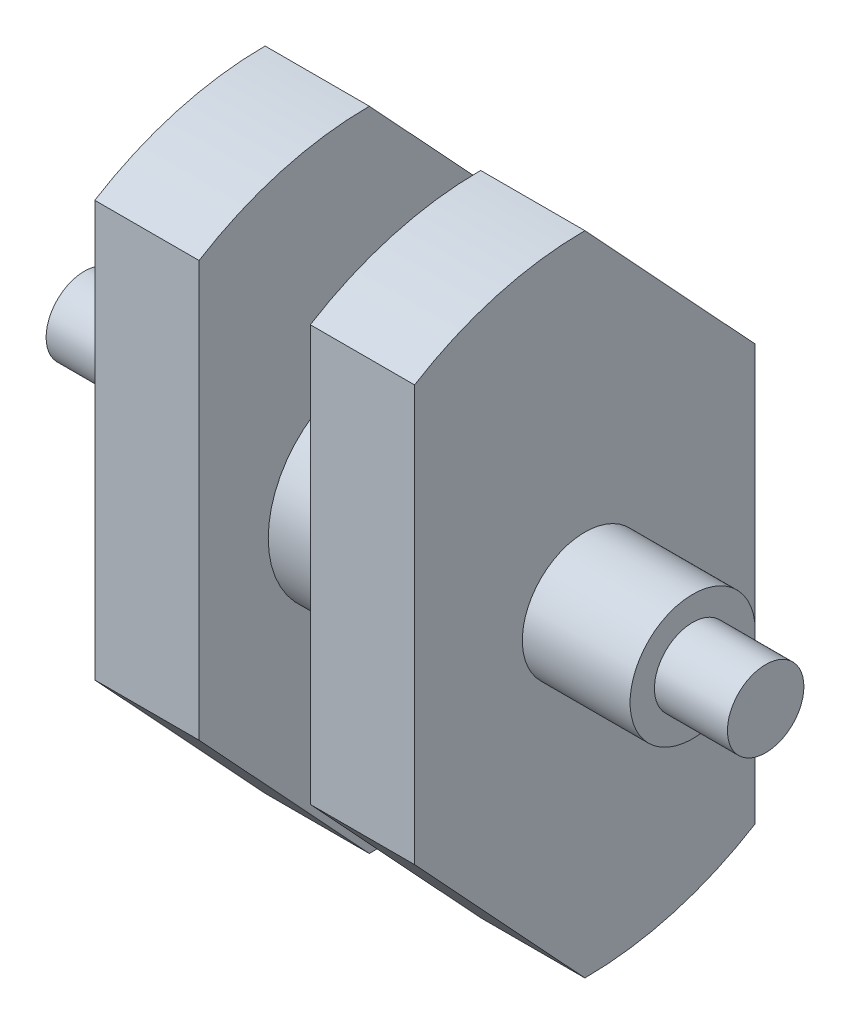
ISO-10303-21;
HEADER;
FILE_DESCRIPTION(('STEP AP214'),'2;1');
FILE_NAME('part.step','',(''),(''),'','','');
FILE_SCHEMA(('AUTOMOTIVE_DESIGN { 1 0 10303 214 1 1 1 1 }'));
ENDSEC;
DATA;
#1=APPLICATION_CONTEXT('core data for automotive mechanical design processes');
#2=APPLICATION_PROTOCOL_DEFINITION('international standard','automotive_design',2000,#1);
#3=PRODUCT_CONTEXT('',#1,'mechanical');
#4=PRODUCT('Part','Part','',(#3));
#5=PRODUCT_RELATED_PRODUCT_CATEGORY('part','',(#4));
#6=PRODUCT_DEFINITION_FORMATION('','',#4);
#7=PRODUCT_DEFINITION_CONTEXT('part definition',#1,'design');
#8=PRODUCT_DEFINITION('design','',#6,#7);
#9=PRODUCT_DEFINITION_SHAPE('','',#8);
#10=(LENGTH_UNIT() NAMED_UNIT(*) SI_UNIT(.MILLI.,.METRE.));
#11=(NAMED_UNIT(*) PLANE_ANGLE_UNIT() SI_UNIT($,.RADIAN.));
#12=(NAMED_UNIT(*) SI_UNIT($,.STERADIAN.) SOLID_ANGLE_UNIT());
#13=UNCERTAINTY_MEASURE_WITH_UNIT(LENGTH_MEASURE(1.E-05),#10,'distance_accuracy_value','');
#14=(GEOMETRIC_REPRESENTATION_CONTEXT(3) GLOBAL_UNCERTAINTY_ASSIGNED_CONTEXT((#13)) GLOBAL_UNIT_ASSIGNED_CONTEXT((#10,
#11,#12)) REPRESENTATION_CONTEXT('',''));
#15=CARTESIAN_POINT('',(0.,0.,0.));
#16=DIRECTION('',(0.,0.,1.));
#17=DIRECTION('',(1.,0.,0.));
#18=AXIS2_PLACEMENT_3D('',#15,#16,#17);
#19=CARTESIAN_POINT('',(49.,0.,0.));
#20=DIRECTION('',(-1.,0.,0.));
#21=DIRECTION('',(0.,0.,1.));
#22=AXIS2_PLACEMENT_3D('',#19,#20,#21);
#23=CYLINDRICAL_SURFACE('',#22,46.55);
#24=CARTESIAN_POINT('',(-7.99999999999994,0.,0.));
#25=DIRECTION('',(1.,0.,0.));
#26=DIRECTION('',(0.,0.,-1.));
#27=AXIS2_PLACEMENT_3D('',#24,#25,#26);
#28=CIRCLE('',#27,46.55);
#29=CARTESIAN_POINT('',(-7.99999999999994,-46.55,0.));
#30=VERTEX_POINT('',#29);
#31=CARTESIAN_POINT('',(-7.99999999999994,-39.5809613324386,-24.5));
#32=VERTEX_POINT('',#31);
#33=EDGE_CURVE('E256',#30,#32,#28,.T.);
#34=ORIENTED_EDGE('',*,*,#33,.F.);
#35=DIRECTION('',(1.,0.,0.));
#36=VECTOR('',#35,1.);
#37=CARTESIAN_POINT('',(-49.,-46.55,0.));
#38=LINE('',#37,#36);
#39=CARTESIAN_POINT('',(-23.,-46.55,0.));
#40=VERTEX_POINT('',#39);
#41=EDGE_CURVE('E166',#40,#30,#38,.T.);
#42=ORIENTED_EDGE('',*,*,#41,.F.);
#43=CARTESIAN_POINT('',(-23.,0.,0.));
#44=DIRECTION('',(-1.,0.,0.));
#45=DIRECTION('',(0.,0.,1.));
#46=AXIS2_PLACEMENT_3D('',#43,#44,#45);
#47=CIRCLE('',#46,46.55);
#48=CARTESIAN_POINT('',(-23.,-39.5809613324386,-24.5));
#49=VERTEX_POINT('',#48);
#50=EDGE_CURVE('E228',#49,#40,#47,.T.);
#51=ORIENTED_EDGE('',*,*,#50,.F.);
#52=DIRECTION('',(1.,0.,0.));
#53=VECTOR('',#52,1.);
#54=CARTESIAN_POINT('',(-49.,-39.5809613324386,-24.5));
#55=LINE('',#54,#53);
#56=EDGE_CURVE('E158',#49,#32,#55,.T.);
#57=ORIENTED_EDGE('',*,*,#56,.T.);
#58=EDGE_LOOP('',(#34,#42,#51,#57));
#59=FACE_BOUND('',#58,.T.);
#60=ADVANCED_FACE('F43',(#59),#23,.T.);
#61=CARTESIAN_POINT('',(-7.99999999999994,0.,0.));
#62=DIRECTION('',(1.,0.,0.));
#63=DIRECTION('',(0.,0.,-1.));
#64=AXIS2_PLACEMENT_3D('',#61,#62,#63);
#65=CIRCLE('',#64,46.55);
#66=CARTESIAN_POINT('',(-7.99999999999994,46.55,0.));
#67=VERTEX_POINT('',#66);
#68=CARTESIAN_POINT('',(-7.99999999999994,39.5809613324384,24.5000000000003));
#69=VERTEX_POINT('',#68);
#70=EDGE_CURVE('E260',#67,#69,#65,.T.);
#71=ORIENTED_EDGE('',*,*,#70,.F.);
#72=DIRECTION('',(1.,0.,0.));
#73=VECTOR('',#72,1.);
#74=CARTESIAN_POINT('',(-49.,46.55,0.));
#75=LINE('',#74,#73);
#76=CARTESIAN_POINT('',(-23.,46.55,0.));
#77=VERTEX_POINT('',#76);
#78=EDGE_CURVE('E146',#77,#67,#75,.T.);
#79=ORIENTED_EDGE('',*,*,#78,.F.);
#80=CARTESIAN_POINT('',(-23.,0.,0.));
#81=DIRECTION('',(-1.,0.,0.));
#82=DIRECTION('',(0.,0.,1.));
#83=AXIS2_PLACEMENT_3D('',#80,#81,#82);
#84=CIRCLE('',#83,46.55);
#85=CARTESIAN_POINT('',(-23.,39.5809613324384,24.5000000000003));
#86=VERTEX_POINT('',#85);
#87=EDGE_CURVE('E221',#86,#77,#84,.T.);
#88=ORIENTED_EDGE('',*,*,#87,.F.);
#89=DIRECTION('',(1.,0.,0.));
#90=VECTOR('',#89,1.);
#91=CARTESIAN_POINT('',(-49.,39.5809613324384,24.5000000000003));
#92=LINE('',#91,#90);
#93=EDGE_CURVE('E175',#86,#69,#92,.T.);
#94=ORIENTED_EDGE('',*,*,#93,.T.);
#95=EDGE_LOOP('',(#71,#79,#88,#94));
#96=FACE_BOUND('',#95,.T.);
#97=ADVANCED_FACE('F269',(#96),#23,.T.);
#98=CARTESIAN_POINT('',(-49.,-1.67741515161766E-13,24.5));
#99=DIRECTION('',(0.,0.,1.));
#100=DIRECTION('',(0.,-1.,0.));
#101=AXIS2_PLACEMENT_3D('',#98,#99,#100);
#102=PLANE('',#101);
#103=DIRECTION('',(1.,0.,0.));
#104=VECTOR('',#103,1.);
#105=CARTESIAN_POINT('',(-49.,-20.1729266217803,24.4999999999999));
#106=LINE('',#105,#104);
#107=CARTESIAN_POINT('',(-23.,-20.1729266217803,24.4999999999999));
#108=VERTEX_POINT('',#107);
#109=CARTESIAN_POINT('',(-7.99999999999994,-20.1729266217803,24.4999999999999));
#110=VERTEX_POINT('',#109);
#111=EDGE_CURVE('E161',#108,#110,#106,.T.);
#112=ORIENTED_EDGE('',*,*,#111,.T.);
#113=DIRECTION('',(0.,1.,0.));
#114=VECTOR('',#113,1.);
#115=CARTESIAN_POINT('',(-7.99999999999994,-1.67741515161766E-13,24.5));
#116=LINE('',#115,#114);
#117=EDGE_CURVE('E196',#110,#69,#116,.T.);
#118=ORIENTED_EDGE('',*,*,#117,.T.);
#119=ORIENTED_EDGE('',*,*,#93,.F.);
#120=DIRECTION('',(0.,-1.,0.));
#121=VECTOR('',#120,1.);
#122=CARTESIAN_POINT('',(-23.,-1.67741515161766E-13,24.5));
#123=LINE('',#122,#121);
#124=EDGE_CURVE('E160',#86,#108,#123,.T.);
#125=ORIENTED_EDGE('',*,*,#124,.T.);
#126=EDGE_LOOP('',(#112,#118,#119,#125));
#127=FACE_BOUND('',#126,.T.);
#128=ADVANCED_FACE('F263',(#127),#102,.T.);
#129=CARTESIAN_POINT('',(-49.,-21.5599054783952,23.2117228094332));
#130=DIRECTION('',(0.,0.680555555555558,-0.73269648272833));
#131=DIRECTION('',(0.,0.73269648272833,0.680555555555558));
#132=AXIS2_PLACEMENT_3D('',#129,#130,#131);
#133=PLANE('',#132);
#134=DIRECTION('',(0.,-0.73269648272833,-0.680555555555558));
#135=VECTOR('',#134,1.);
#136=CARTESIAN_POINT('',(-7.99999999999994,-21.5599054783952,23.2117228094332));
#137=LINE('',#136,#135);
#138=EDGE_CURVE('E258',#110,#30,#137,.T.);
#139=ORIENTED_EDGE('',*,*,#138,.F.);
#140=ORIENTED_EDGE('',*,*,#111,.F.);
#141=DIRECTION('',(0.,0.73269648272833,0.680555555555558));
#142=VECTOR('',#141,1.);
#143=CARTESIAN_POINT('',(-23.,-21.5599054783952,23.2117228094332));
#144=LINE('',#143,#142);
#145=EDGE_CURVE('E227',#40,#108,#144,.T.);
#146=ORIENTED_EDGE('',*,*,#145,.F.);
#147=ORIENTED_EDGE('',*,*,#41,.T.);
#148=EDGE_LOOP('',(#139,#140,#146,#147));
#149=FACE_BOUND('',#148,.T.);
#150=ADVANCED_FACE('F283',(#149),#133,.F.);
#151=CARTESIAN_POINT('',(-49.,0.,-24.5));
#152=DIRECTION('',(0.,0.,1.));
#153=DIRECTION('',(1.,0.,0.));
#154=AXIS2_PLACEMENT_3D('',#151,#152,#153);
#155=PLANE('',#154);
#156=DIRECTION('',(0.,1.,0.));
#157=VECTOR('',#156,1.);
#158=CARTESIAN_POINT('',(-7.99999999999994,0.,-24.5));
#159=LINE('',#158,#157);
#160=CARTESIAN_POINT('',(-7.99999999999994,20.17292662178,-24.5));
#161=VERTEX_POINT('',#160);
#162=EDGE_CURVE('E61',#32,#161,#159,.T.);
#163=ORIENTED_EDGE('',*,*,#162,.F.);
#164=ORIENTED_EDGE('',*,*,#56,.F.);
#165=DIRECTION('',(0.,-1.,0.));
#166=VECTOR('',#165,1.);
#167=CARTESIAN_POINT('',(-23.,0.,-24.5));
#168=LINE('',#167,#166);
#169=CARTESIAN_POINT('',(-23.,20.17292662178,-24.5));
#170=VERTEX_POINT('',#169);
#171=EDGE_CURVE('E225',#170,#49,#168,.T.);
#172=ORIENTED_EDGE('',*,*,#171,.F.);
#173=DIRECTION('',(1.,0.,0.));
#174=VECTOR('',#173,1.);
#175=CARTESIAN_POINT('',(-49.,20.17292662178,-24.5));
#176=LINE('',#175,#174);
#177=EDGE_CURVE('E149',#170,#161,#176,.T.);
#178=ORIENTED_EDGE('',*,*,#177,.T.);
#179=EDGE_LOOP('',(#163,#164,#172,#178));
#180=FACE_BOUND('',#179,.T.);
#181=ADVANCED_FACE('F279',(#180),#155,.F.);
#182=CARTESIAN_POINT('',(-49.,21.5599054783951,-23.2117228094332));
#183=DIRECTION('',(0.,-0.680555555555556,0.732696482728332));
#184=DIRECTION('',(0.,-0.732696482728332,-0.680555555555556));
#185=AXIS2_PLACEMENT_3D('',#182,#183,#184);
#186=PLANE('',#185);
#187=DIRECTION('',(0.,0.732696482728332,0.680555555555556));
#188=VECTOR('',#187,1.);
#189=CARTESIAN_POINT('',(-7.99999999999994,21.5599054783951,-23.2117228094332));
#190=LINE('',#189,#188);
#191=EDGE_CURVE('E12',#161,#67,#190,.T.);
#192=ORIENTED_EDGE('',*,*,#191,.F.);
#193=ORIENTED_EDGE('',*,*,#177,.F.);
#194=DIRECTION('',(0.,-0.732696482728332,-0.680555555555556));
#195=VECTOR('',#194,1.);
#196=CARTESIAN_POINT('',(-23.,21.5599054783951,-23.2117228094332));
#197=LINE('',#196,#195);
#198=EDGE_CURVE('E168',#77,#170,#197,.T.);
#199=ORIENTED_EDGE('',*,*,#198,.F.);
#200=ORIENTED_EDGE('',*,*,#78,.T.);
#201=EDGE_LOOP('',(#192,#193,#199,#200));
#202=FACE_BOUND('',#201,.T.);
#203=ADVANCED_FACE('F277',(#202),#186,.F.);
#204=CARTESIAN_POINT('',(-23.,0.,0.));
#205=DIRECTION('',(-1.,0.,0.));
#206=DIRECTION('',(0.,0.,1.));
#207=AXIS2_PLACEMENT_3D('',#204,#205,#206);
#208=CYLINDRICAL_SURFACE('',#207,9.);
#209=CARTESIAN_POINT('',(-23.,0.,0.));
#210=DIRECTION('',(1.,0.,0.));
#211=DIRECTION('',(0.,0.,-1.));
#212=AXIS2_PLACEMENT_3D('',#209,#210,#211);
#213=CIRCLE('',#212,9.);
#214=CARTESIAN_POINT('',(-23.,0.,9.));
#215=VERTEX_POINT('',#214);
#216=EDGE_CURVE('E218',#215,#215,#213,.T.);
#217=CARTESIAN_POINT('',(-38.5,0.,0.));
#218=DIRECTION('',(-1.,0.,0.));
#219=DIRECTION('',(0.,0.,1.));
#220=AXIS2_PLACEMENT_3D('',#217,#218,#219);
#221=CIRCLE('',#220,9.);
#222=CARTESIAN_POINT('',(-38.5,0.,9.));
#223=VERTEX_POINT('',#222);
#224=EDGE_CURVE('E185',#223,#223,#221,.T.);
#225=CARTESIAN_POINT('',(-23.,0.,9.));
#226=CARTESIAN_POINT('',(-23.1614583333333,0.,9.));
#227=CARTESIAN_POINT('',(-23.3229166666667,0.,9.));
#228=CARTESIAN_POINT('',(-23.6458333333333,0.,9.));
#229=CARTESIAN_POINT('',(-23.8072916666667,0.,9.));
#230=CARTESIAN_POINT('',(-24.1302083333333,0.,9.));
#231=CARTESIAN_POINT('',(-24.2916666666667,0.,9.));
#232=CARTESIAN_POINT('',(-24.6145833333333,0.,9.));
#233=CARTESIAN_POINT('',(-24.7760416666667,0.,9.));
#234=CARTESIAN_POINT('',(-25.0989583333333,0.,9.));
#235=CARTESIAN_POINT('',(-25.2604166666667,0.,9.));
#236=CARTESIAN_POINT('',(-25.5833333333333,0.,9.));
#237=CARTESIAN_POINT('',(-25.7447916666667,0.,9.));
#238=CARTESIAN_POINT('',(-26.0677083333333,0.,9.));
#239=CARTESIAN_POINT('',(-26.2291666666667,0.,9.));
#240=CARTESIAN_POINT('',(-26.5520833333333,0.,9.));
#241=CARTESIAN_POINT('',(-26.7135416666667,0.,9.));
#242=CARTESIAN_POINT('',(-27.0364583333333,0.,9.));
#243=CARTESIAN_POINT('',(-27.1979166666667,0.,9.));
#244=CARTESIAN_POINT('',(-27.5208333333333,0.,9.));
#245=CARTESIAN_POINT('',(-27.6822916666667,0.,9.));
#246=CARTESIAN_POINT('',(-28.0052083333333,0.,9.));
#247=CARTESIAN_POINT('',(-28.1666666666667,0.,9.));
#248=CARTESIAN_POINT('',(-28.4895833333333,0.,9.));
#249=CARTESIAN_POINT('',(-28.6510416666667,0.,9.));
#250=CARTESIAN_POINT('',(-28.9739583333333,0.,9.));
#251=CARTESIAN_POINT('',(-29.1354166666667,0.,9.));
#252=CARTESIAN_POINT('',(-29.4583333333333,0.,9.));
#253=CARTESIAN_POINT('',(-29.6197916666667,0.,9.));
#254=CARTESIAN_POINT('',(-29.9427083333333,0.,9.));
#255=CARTESIAN_POINT('',(-30.1041666666667,0.,9.));
#256=CARTESIAN_POINT('',(-30.4270833333333,0.,9.));
#257=CARTESIAN_POINT('',(-30.5885416666667,0.,9.));
#258=CARTESIAN_POINT('',(-30.9114583333333,0.,9.));
#259=CARTESIAN_POINT('',(-31.0729166666667,0.,9.));
#260=CARTESIAN_POINT('',(-31.3958333333333,0.,9.));
#261=CARTESIAN_POINT('',(-31.5572916666667,0.,9.));
#262=CARTESIAN_POINT('',(-31.8802083333333,0.,9.));
#263=CARTESIAN_POINT('',(-32.0416666666667,0.,9.));
#264=CARTESIAN_POINT('',(-32.3645833333333,0.,9.));
#265=CARTESIAN_POINT('',(-32.5260416666667,0.,9.));
#266=CARTESIAN_POINT('',(-32.8489583333333,0.,9.));
#267=CARTESIAN_POINT('',(-33.0104166666667,0.,9.));
#268=CARTESIAN_POINT('',(-33.3333333333333,0.,9.));
#269=CARTESIAN_POINT('',(-33.4947916666667,0.,9.));
#270=CARTESIAN_POINT('',(-33.8177083333333,0.,9.));
#271=CARTESIAN_POINT('',(-33.9791666666667,0.,9.));
#272=CARTESIAN_POINT('',(-34.3020833333333,0.,9.));
#273=CARTESIAN_POINT('',(-34.4635416666667,0.,9.));
#274=CARTESIAN_POINT('',(-34.7864583333333,0.,9.));
#275=CARTESIAN_POINT('',(-34.9479166666667,0.,9.));
#276=CARTESIAN_POINT('',(-35.2708333333333,0.,9.));
#277=CARTESIAN_POINT('',(-35.4322916666667,0.,9.));
#278=CARTESIAN_POINT('',(-35.7552083333333,0.,9.));
#279=CARTESIAN_POINT('',(-35.9166666666667,0.,9.));
#280=CARTESIAN_POINT('',(-36.2395833333333,0.,9.));
#281=CARTESIAN_POINT('',(-36.4010416666667,0.,9.));
#282=CARTESIAN_POINT('',(-36.7239583333333,0.,9.));
#283=CARTESIAN_POINT('',(-36.8854166666667,0.,9.));
#284=CARTESIAN_POINT('',(-37.2083333333333,0.,9.));
#285=CARTESIAN_POINT('',(-37.3697916666667,0.,9.));
#286=CARTESIAN_POINT('',(-37.6927083333333,0.,9.));
#287=CARTESIAN_POINT('',(-37.8541666666667,0.,9.));
#288=CARTESIAN_POINT('',(-38.1770833333333,0.,9.));
#289=CARTESIAN_POINT('',(-38.3385416666667,0.,9.));
#290=CARTESIAN_POINT('',(-38.5,0.,9.));
#291=B_SPLINE_CURVE_WITH_KNOTS('',3,(#225,#226,#227,#228,#229,#230,#231,#232,#233,#234,#235,
#236,#237,#238,#239,#240,#241,#242,#243,#244,#245,#246,#247,#248,#249,#250,#251,#252,#253,#254,
#255,#256,#257,#258,#259,#260,#261,#262,#263,#264,#265,#266,#267,#268,#269,#270,#271,#272,#273,
#274,#275,#276,#277,#278,#279,#280,#281,#282,#283,#284,#285,#286,#287,#288,#289,#290),
.UNSPECIFIED.,.F.,.F.,(4,2,2,2,2,2,2,2,2,2,2,2,2,2,2,2,2,2,2,2,2,2,2,2,2,2,2,2,2,2,2,2,4),(0.,
0.484374999999999,0.968749999999997,1.453125,1.9375,2.421875,2.90625,3.390625,3.875,4.359375,
4.84374999999999,5.328125,5.81249999999999,6.29687499999999,6.78125,7.26562499999999,
7.74999999999999,8.23437499999999,8.71875,9.20312499999999,9.68749999999999,10.171875,10.65625,
11.140625,11.625,12.109375,12.59375,13.078125,13.5625,14.046875,14.53125,15.015625,15.5),.UNSPECIFIED.);
#292=EDGE_CURVE('BSEAM358',#215,#223,#291,.T.);
#293=ORIENTED_EDGE('',*,*,#216,.F.);
#294=ORIENTED_EDGE('',*,*,#224,.F.);
#295=ORIENTED_EDGE('',*,*,#292,.T.);
#296=ORIENTED_EDGE('',*,*,#292,.F.);
#297=EDGE_LOOP('',(#293,#295,#294,#296));
#298=FACE_BOUND('',#297,.T.);
#299=ADVANCED_FACE('F358',(#298),#208,.T.);
#300=CARTESIAN_POINT('',(-23.,0.,0.));
#301=DIRECTION('',(-1.,0.,0.));
#302=DIRECTION('',(0.,0.,1.));
#303=AXIS2_PLACEMENT_3D('',#300,#301,#302);
#304=PLANE('',#303);
#305=ORIENTED_EDGE('',*,*,#87,.T.);
#306=ORIENTED_EDGE('',*,*,#198,.T.);
#307=ORIENTED_EDGE('',*,*,#171,.T.);
#308=ORIENTED_EDGE('',*,*,#50,.T.);
#309=ORIENTED_EDGE('',*,*,#145,.T.);
#310=ORIENTED_EDGE('',*,*,#124,.F.);
#311=EDGE_LOOP('',(#305,#306,#307,#308,#309,#310));
#312=FACE_BOUND('',#311,.T.);
#313=ORIENTED_EDGE('',*,*,#216,.T.);
#314=EDGE_LOOP('',(#313));
#315=FACE_BOUND('',#314,.T.);
#316=ADVANCED_FACE('F272',(#312,#315),#304,.T.);
#317=CARTESIAN_POINT('',(-38.5,0.,1.31838984174237E-13));
#318=DIRECTION('',(-1.,0.,0.));
#319=DIRECTION('',(0.,0.,1.));
#320=AXIS2_PLACEMENT_3D('',#317,#318,#319);
#321=PLANE('',#320);
#322=CARTESIAN_POINT('',(-38.5,0.,0.));
#323=DIRECTION('',(-1.,0.,0.));
#324=DIRECTION('',(0.,0.,1.));
#325=AXIS2_PLACEMENT_3D('',#322,#323,#324);
#326=CIRCLE('',#325,5.5);
#327=CARTESIAN_POINT('',(-38.5,0.,5.5));
#328=VERTEX_POINT('',#327);
#329=EDGE_CURVE('E184',#328,#328,#326,.T.);
#330=ORIENTED_EDGE('',*,*,#329,.F.);
#331=EDGE_LOOP('',(#330));
#332=FACE_BOUND('',#331,.T.);
#333=ORIENTED_EDGE('',*,*,#224,.T.);
#334=EDGE_LOOP('',(#333));
#335=FACE_BOUND('',#334,.T.);
#336=ADVANCED_FACE('F339',(#332,#335),#321,.T.);
#337=CARTESIAN_POINT('',(-38.5,0.,0.));
#338=DIRECTION('',(-1.,0.,0.));
#339=DIRECTION('',(0.,0.,1.));
#340=AXIS2_PLACEMENT_3D('',#337,#338,#339);
#341=CYLINDRICAL_SURFACE('',#340,5.5);
#342=CARTESIAN_POINT('',(-49.,0.,0.));
#343=DIRECTION('',(-1.,0.,0.));
#344=DIRECTION('',(0.,0.,1.));
#345=AXIS2_PLACEMENT_3D('',#342,#343,#344);
#346=CIRCLE('',#345,5.5);
#347=CARTESIAN_POINT('',(-49.,0.,5.5));
#348=VERTEX_POINT('',#347);
#349=EDGE_CURVE('E192',#348,#348,#346,.T.);
#350=CARTESIAN_POINT('',(-38.5,0.,5.5));
#351=CARTESIAN_POINT('',(-38.609375,0.,5.5));
#352=CARTESIAN_POINT('',(-38.71875,0.,5.5));
#353=CARTESIAN_POINT('',(-38.9375,0.,5.5));
#354=CARTESIAN_POINT('',(-39.046875,0.,5.5));
#355=CARTESIAN_POINT('',(-39.265625,0.,5.5));
#356=CARTESIAN_POINT('',(-39.375,0.,5.5));
#357=CARTESIAN_POINT('',(-39.59375,0.,5.5));
#358=CARTESIAN_POINT('',(-39.703125,0.,5.5));
#359=CARTESIAN_POINT('',(-39.921875,0.,5.5));
#360=CARTESIAN_POINT('',(-40.03125,0.,5.5));
#361=CARTESIAN_POINT('',(-40.25,0.,5.5));
#362=CARTESIAN_POINT('',(-40.359375,0.,5.5));
#363=CARTESIAN_POINT('',(-40.578125,0.,5.5));
#364=CARTESIAN_POINT('',(-40.6875,0.,5.5));
#365=CARTESIAN_POINT('',(-40.90625,0.,5.5));
#366=CARTESIAN_POINT('',(-41.015625,0.,5.5));
#367=CARTESIAN_POINT('',(-41.234375,0.,5.5));
#368=CARTESIAN_POINT('',(-41.34375,0.,5.5));
#369=CARTESIAN_POINT('',(-41.5625,0.,5.5));
#370=CARTESIAN_POINT('',(-41.671875,0.,5.5));
#371=CARTESIAN_POINT('',(-41.890625,0.,5.5));
#372=CARTESIAN_POINT('',(-42.,0.,5.5));
#373=CARTESIAN_POINT('',(-42.21875,0.,5.5));
#374=CARTESIAN_POINT('',(-42.328125,0.,5.5));
#375=CARTESIAN_POINT('',(-42.546875,0.,5.5));
#376=CARTESIAN_POINT('',(-42.65625,0.,5.5));
#377=CARTESIAN_POINT('',(-42.875,0.,5.5));
#378=CARTESIAN_POINT('',(-42.984375,0.,5.5));
#379=CARTESIAN_POINT('',(-43.203125,0.,5.5));
#380=CARTESIAN_POINT('',(-43.3125,0.,5.5));
#381=CARTESIAN_POINT('',(-43.53125,0.,5.5));
#382=CARTESIAN_POINT('',(-43.640625,0.,5.5));
#383=CARTESIAN_POINT('',(-43.859375,0.,5.5));
#384=CARTESIAN_POINT('',(-43.96875,0.,5.5));
#385=CARTESIAN_POINT('',(-44.1875,0.,5.5));
#386=CARTESIAN_POINT('',(-44.296875,0.,5.5));
#387=CARTESIAN_POINT('',(-44.515625,0.,5.5));
#388=CARTESIAN_POINT('',(-44.625,0.,5.5));
#389=CARTESIAN_POINT('',(-44.84375,0.,5.5));
#390=CARTESIAN_POINT('',(-44.953125,0.,5.5));
#391=CARTESIAN_POINT('',(-45.171875,0.,5.5));
#392=CARTESIAN_POINT('',(-45.28125,0.,5.5));
#393=CARTESIAN_POINT('',(-45.5,0.,5.5));
#394=CARTESIAN_POINT('',(-45.609375,0.,5.5));
#395=CARTESIAN_POINT('',(-45.828125,0.,5.5));
#396=CARTESIAN_POINT('',(-45.9375,0.,5.5));
#397=CARTESIAN_POINT('',(-46.15625,0.,5.5));
#398=CARTESIAN_POINT('',(-46.265625,0.,5.5));
#399=CARTESIAN_POINT('',(-46.484375,0.,5.5));
#400=CARTESIAN_POINT('',(-46.59375,0.,5.5));
#401=CARTESIAN_POINT('',(-46.8125,0.,5.5));
#402=CARTESIAN_POINT('',(-46.921875,0.,5.5));
#403=CARTESIAN_POINT('',(-47.140625,0.,5.5));
#404=CARTESIAN_POINT('',(-47.25,0.,5.5));
#405=CARTESIAN_POINT('',(-47.46875,0.,5.5));
#406=CARTESIAN_POINT('',(-47.578125,0.,5.5));
#407=CARTESIAN_POINT('',(-47.796875,0.,5.5));
#408=CARTESIAN_POINT('',(-47.90625,0.,5.5));
#409=CARTESIAN_POINT('',(-48.125,0.,5.5));
#410=CARTESIAN_POINT('',(-48.234375,0.,5.5));
#411=CARTESIAN_POINT('',(-48.453125,0.,5.5));
#412=CARTESIAN_POINT('',(-48.5625,0.,5.5));
#413=CARTESIAN_POINT('',(-48.78125,0.,5.5));
#414=CARTESIAN_POINT('',(-48.890625,0.,5.5));
#415=CARTESIAN_POINT('',(-49.,0.,5.5));
#416=B_SPLINE_CURVE_WITH_KNOTS('',3,(#350,#351,#352,#353,#354,#355,#356,#357,#358,#359,#360,
#361,#362,#363,#364,#365,#366,#367,#368,#369,#370,#371,#372,#373,#374,#375,#376,#377,#378,#379,
#380,#381,#382,#383,#384,#385,#386,#387,#388,#389,#390,#391,#392,#393,#394,#395,#396,#397,#398,
#399,#400,#401,#402,#403,#404,#405,#406,#407,#408,#409,#410,#411,#412,#413,#414,#415),
.UNSPECIFIED.,.F.,.F.,(4,2,2,2,2,2,2,2,2,2,2,2,2,2,2,2,2,2,2,2,2,2,2,2,2,2,2,2,2,2,2,2,4),(0.,
0.328125000000005,0.656250000000004,0.984375000000003,1.3125,1.64062500000001,1.96875000000001,
2.296875,2.625,2.953125,3.28125000000001,3.609375,3.9375,4.265625,4.59375,4.92187500000001,5.25,
5.578125,5.90625,6.234375,6.56250000000001,6.890625,7.21875,7.546875,7.87500000000001,
8.20312500000001,8.53125,8.859375,9.1875,9.515625,9.84375000000001,10.171875,10.5),.UNSPECIFIED.);
#417=EDGE_CURVE('BSEAM337',#328,#348,#416,.T.);
#418=ORIENTED_EDGE('',*,*,#329,.T.);
#419=ORIENTED_EDGE('',*,*,#349,.F.);
#420=ORIENTED_EDGE('',*,*,#417,.T.);
#421=ORIENTED_EDGE('',*,*,#417,.F.);
#422=EDGE_LOOP('',(#418,#420,#419,#421));
#423=FACE_BOUND('',#422,.T.);
#424=ADVANCED_FACE('F337',(#423),#341,.T.);
#425=CARTESIAN_POINT('',(-49.,0.,0.));
#426=DIRECTION('',(1.,0.,0.));
#427=DIRECTION('',(0.,0.,-1.));
#428=AXIS2_PLACEMENT_3D('',#425,#426,#427);
#429=PLANE('',#428);
#430=ORIENTED_EDGE('',*,*,#349,.T.);
#431=EDGE_LOOP('',(#430));
#432=FACE_BOUND('',#431,.T.);
#433=ADVANCED_FACE('F333',(#432),#429,.F.);
#434=CARTESIAN_POINT('',(-1000.,0.,0.));
#435=DIRECTION('',(-1.,0.,0.));
#436=DIRECTION('',(0.,0.,1.));
#437=AXIS2_PLACEMENT_3D('',#434,#435,#436);
#438=CYLINDRICAL_SURFACE('',#437,14.55);
#439=CARTESIAN_POINT('',(7.99999999999979,0.,0.));
#440=DIRECTION('',(-1.,0.,0.));
#441=DIRECTION('',(0.,0.,1.));
#442=AXIS2_PLACEMENT_3D('',#439,#440,#441);
#443=CIRCLE('',#442,14.55);
#444=CARTESIAN_POINT('',(7.99999999999979,0.,14.55));
#445=VERTEX_POINT('',#444);
#446=EDGE_CURVE('E312',#445,#445,#443,.T.);
#447=ORIENTED_EDGE('',*,*,#446,.T.);
#448=EDGE_LOOP('',(#447));
#449=FACE_BOUND('',#448,.T.);
#450=CARTESIAN_POINT('',(-7.9999999999999,0.,0.));
#451=DIRECTION('',(-1.,0.,0.));
#452=DIRECTION('',(0.,0.,1.));
#453=AXIS2_PLACEMENT_3D('',#450,#451,#452);
#454=CIRCLE('',#453,14.55);
#455=CARTESIAN_POINT('',(-7.9999999999999,0.,14.55));
#456=VERTEX_POINT('',#455);
#457=EDGE_CURVE('E141',#456,#456,#454,.T.);
#458=ORIENTED_EDGE('',*,*,#457,.F.);
#459=EDGE_LOOP('',(#458));
#460=FACE_BOUND('',#459,.T.);
#461=ADVANCED_FACE('F320',(#449,#460),#438,.T.);
#462=CARTESIAN_POINT('',(-7.99999999999995,14.55,0.));
#463=DIRECTION('',(1.,0.,0.));
#464=DIRECTION('',(0.,0.,-1.));
#465=AXIS2_PLACEMENT_3D('',#462,#463,#464);
#466=PLANE('',#465);
#467=ORIENTED_EDGE('',*,*,#138,.T.);
#468=ORIENTED_EDGE('',*,*,#33,.T.);
#469=ORIENTED_EDGE('',*,*,#162,.T.);
#470=ORIENTED_EDGE('',*,*,#191,.T.);
#471=ORIENTED_EDGE('',*,*,#70,.T.);
#472=ORIENTED_EDGE('',*,*,#117,.F.);
#473=EDGE_LOOP('',(#467,#468,#469,#470,#471,#472));
#474=FACE_BOUND('',#473,.T.);
#475=ORIENTED_EDGE('',*,*,#457,.T.);
#476=EDGE_LOOP('',(#475));
#477=FACE_BOUND('',#476,.T.);
#478=ADVANCED_FACE('F322',(#474,#477),#466,.T.);
#479=CARTESIAN_POINT('',(7.99999999999981,51.4116015265014,0.));
#480=DIRECTION('',(-1.,0.,0.));
#481=DIRECTION('',(0.,0.,1.));
#482=AXIS2_PLACEMENT_3D('',#479,#480,#481);
#483=PLANE('',#482);
#484=CARTESIAN_POINT('',(7.99999999999981,0.,0.));
#485=DIRECTION('',(-1.,0.,0.));
#486=DIRECTION('',(0.,0.,1.));
#487=AXIS2_PLACEMENT_3D('',#484,#485,#486);
#488=CIRCLE('',#487,46.55);
#489=CARTESIAN_POINT('',(7.99999999999981,39.5809613324384,24.5000000000003));
#490=VERTEX_POINT('',#489);
#491=CARTESIAN_POINT('',(7.99999999999981,46.55,0.));
#492=VERTEX_POINT('',#491);
#493=EDGE_CURVE('E60',#490,#492,#488,.T.);
#494=ORIENTED_EDGE('',*,*,#493,.T.);
#495=DIRECTION('',(0.,-0.732696482728332,-0.680555555555556));
#496=VECTOR('',#495,1.);
#497=CARTESIAN_POINT('',(7.99999999999981,21.5599054783951,-23.2117228094332));
#498=LINE('',#497,#496);
#499=CARTESIAN_POINT('',(7.99999999999981,20.17292662178,-24.5));
#500=VERTEX_POINT('',#499);
#501=EDGE_CURVE('E49',#492,#500,#498,.T.);
#502=ORIENTED_EDGE('',*,*,#501,.T.);
#503=DIRECTION('',(0.,-1.,0.));
#504=VECTOR('',#503,1.);
#505=CARTESIAN_POINT('',(7.99999999999981,0.,-24.5));
#506=LINE('',#505,#504);
#507=CARTESIAN_POINT('',(7.99999999999981,-39.5809613324386,-24.5));
#508=VERTEX_POINT('',#507);
#509=EDGE_CURVE('E128',#500,#508,#506,.T.);
#510=ORIENTED_EDGE('',*,*,#509,.T.);
#511=CARTESIAN_POINT('',(7.99999999999981,0.,0.));
#512=DIRECTION('',(-1.,0.,0.));
#513=DIRECTION('',(0.,0.,1.));
#514=AXIS2_PLACEMENT_3D('',#511,#512,#513);
#515=CIRCLE('',#514,46.55);
#516=CARTESIAN_POINT('',(7.99999999999981,-46.55,0.));
#517=VERTEX_POINT('',#516);
#518=EDGE_CURVE('E238',#508,#517,#515,.T.);
#519=ORIENTED_EDGE('',*,*,#518,.T.);
#520=DIRECTION('',(0.,0.73269648272833,0.680555555555558));
#521=VECTOR('',#520,1.);
#522=CARTESIAN_POINT('',(7.99999999999981,-21.5599054783952,23.2117228094332));
#523=LINE('',#522,#521);
#524=CARTESIAN_POINT('',(7.99999999999981,-20.1729266217803,24.4999999999999));
#525=VERTEX_POINT('',#524);
#526=EDGE_CURVE('E247',#517,#525,#523,.T.);
#527=ORIENTED_EDGE('',*,*,#526,.T.);
#528=DIRECTION('',(0.,-1.,0.));
#529=VECTOR('',#528,1.);
#530=CARTESIAN_POINT('',(7.99999999999981,-1.67741515161766E-13,24.5));
#531=LINE('',#530,#529);
#532=EDGE_CURVE('E249',#490,#525,#531,.T.);
#533=ORIENTED_EDGE('',*,*,#532,.F.);
#534=EDGE_LOOP('',(#494,#502,#510,#519,#527,#533));
#535=FACE_BOUND('',#534,.T.);
#536=ORIENTED_EDGE('',*,*,#446,.F.);
#537=EDGE_LOOP('',(#536));
#538=FACE_BOUND('',#537,.T.);
#539=ADVANCED_FACE('F129',(#535,#538),#483,.T.);
#540=CARTESIAN_POINT('',(49.,0.,0.));
#541=DIRECTION('',(1.,0.,0.));
#542=DIRECTION('',(0.,0.,-1.));
#543=AXIS2_PLACEMENT_3D('',#540,#541,#542);
#544=PLANE('',#543);
#545=CARTESIAN_POINT('',(49.,0.,0.));
#546=DIRECTION('',(1.,0.,0.));
#547=DIRECTION('',(0.,0.,-1.));
#548=AXIS2_PLACEMENT_3D('',#545,#546,#547);
#549=CIRCLE('',#548,5.5);
#550=CARTESIAN_POINT('',(49.,0.,-5.5));
#551=VERTEX_POINT('',#550);
#552=EDGE_CURVE('E183',#551,#551,#549,.T.);
#553=ORIENTED_EDGE('',*,*,#552,.T.);
#554=EDGE_LOOP('',(#553));
#555=FACE_BOUND('',#554,.T.);
#556=ADVANCED_FACE('F318',(#555),#544,.T.);
#557=CARTESIAN_POINT('',(38.5,0.,0.));
#558=DIRECTION('',(1.,0.,0.));
#559=DIRECTION('',(0.,0.,-1.));
#560=AXIS2_PLACEMENT_3D('',#557,#558,#559);
#561=CYLINDRICAL_SURFACE('',#560,5.5);
#562=CARTESIAN_POINT('',(38.5,0.,0.));
#563=DIRECTION('',(1.,0.,0.));
#564=DIRECTION('',(0.,0.,-1.));
#565=AXIS2_PLACEMENT_3D('',#562,#563,#564);
#566=CIRCLE('',#565,5.5);
#567=CARTESIAN_POINT('',(38.5,0.,-5.5));
#568=VERTEX_POINT('',#567);
#569=EDGE_CURVE('E181',#568,#568,#566,.T.);
#570=CARTESIAN_POINT('',(38.5,0.,-5.5));
#571=CARTESIAN_POINT('',(38.609375,0.,-5.5));
#572=CARTESIAN_POINT('',(38.71875,0.,-5.5));
#573=CARTESIAN_POINT('',(38.9375,0.,-5.5));
#574=CARTESIAN_POINT('',(39.046875,0.,-5.5));
#575=CARTESIAN_POINT('',(39.265625,0.,-5.5));
#576=CARTESIAN_POINT('',(39.375,0.,-5.5));
#577=CARTESIAN_POINT('',(39.59375,0.,-5.5));
#578=CARTESIAN_POINT('',(39.703125,0.,-5.5));
#579=CARTESIAN_POINT('',(39.921875,0.,-5.5));
#580=CARTESIAN_POINT('',(40.03125,0.,-5.5));
#581=CARTESIAN_POINT('',(40.25,0.,-5.5));
#582=CARTESIAN_POINT('',(40.359375,0.,-5.5));
#583=CARTESIAN_POINT('',(40.578125,0.,-5.5));
#584=CARTESIAN_POINT('',(40.6875,0.,-5.5));
#585=CARTESIAN_POINT('',(40.90625,0.,-5.5));
#586=CARTESIAN_POINT('',(41.015625,0.,-5.5));
#587=CARTESIAN_POINT('',(41.234375,0.,-5.5));
#588=CARTESIAN_POINT('',(41.34375,0.,-5.5));
#589=CARTESIAN_POINT('',(41.5625,0.,-5.5));
#590=CARTESIAN_POINT('',(41.671875,0.,-5.5));
#591=CARTESIAN_POINT('',(41.890625,0.,-5.5));
#592=CARTESIAN_POINT('',(42.,0.,-5.5));
#593=CARTESIAN_POINT('',(42.21875,0.,-5.5));
#594=CARTESIAN_POINT('',(42.328125,0.,-5.5));
#595=CARTESIAN_POINT('',(42.546875,0.,-5.5));
#596=CARTESIAN_POINT('',(42.65625,0.,-5.5));
#597=CARTESIAN_POINT('',(42.875,0.,-5.5));
#598=CARTESIAN_POINT('',(42.984375,0.,-5.5));
#599=CARTESIAN_POINT('',(43.203125,0.,-5.5));
#600=CARTESIAN_POINT('',(43.3125,0.,-5.5));
#601=CARTESIAN_POINT('',(43.53125,0.,-5.5));
#602=CARTESIAN_POINT('',(43.640625,0.,-5.5));
#603=CARTESIAN_POINT('',(43.859375,0.,-5.5));
#604=CARTESIAN_POINT('',(43.96875,0.,-5.5));
#605=CARTESIAN_POINT('',(44.1875,0.,-5.5));
#606=CARTESIAN_POINT('',(44.296875,0.,-5.5));
#607=CARTESIAN_POINT('',(44.515625,0.,-5.5));
#608=CARTESIAN_POINT('',(44.625,0.,-5.5));
#609=CARTESIAN_POINT('',(44.84375,0.,-5.5));
#610=CARTESIAN_POINT('',(44.953125,0.,-5.5));
#611=CARTESIAN_POINT('',(45.171875,0.,-5.5));
#612=CARTESIAN_POINT('',(45.28125,0.,-5.5));
#613=CARTESIAN_POINT('',(45.5,0.,-5.5));
#614=CARTESIAN_POINT('',(45.609375,0.,-5.5));
#615=CARTESIAN_POINT('',(45.828125,0.,-5.5));
#616=CARTESIAN_POINT('',(45.9375,0.,-5.5));
#617=CARTESIAN_POINT('',(46.15625,0.,-5.5));
#618=CARTESIAN_POINT('',(46.265625,0.,-5.5));
#619=CARTESIAN_POINT('',(46.484375,0.,-5.5));
#620=CARTESIAN_POINT('',(46.59375,0.,-5.5));
#621=CARTESIAN_POINT('',(46.8125,0.,-5.5));
#622=CARTESIAN_POINT('',(46.921875,0.,-5.5));
#623=CARTESIAN_POINT('',(47.140625,0.,-5.5));
#624=CARTESIAN_POINT('',(47.25,0.,-5.5));
#625=CARTESIAN_POINT('',(47.46875,0.,-5.5));
#626=CARTESIAN_POINT('',(47.578125,0.,-5.5));
#627=CARTESIAN_POINT('',(47.796875,0.,-5.5));
#628=CARTESIAN_POINT('',(47.90625,0.,-5.5));
#629=CARTESIAN_POINT('',(48.125,0.,-5.5));
#630=CARTESIAN_POINT('',(48.234375,0.,-5.5));
#631=CARTESIAN_POINT('',(48.453125,0.,-5.5));
#632=CARTESIAN_POINT('',(48.5625,0.,-5.5));
#633=CARTESIAN_POINT('',(48.78125,0.,-5.5));
#634=CARTESIAN_POINT('',(48.890625,0.,-5.5));
#635=CARTESIAN_POINT('',(49.,0.,-5.5));
#636=B_SPLINE_CURVE_WITH_KNOTS('',3,(#570,#571,#572,#573,#574,#575,#576,#577,#578,#579,#580,
#581,#582,#583,#584,#585,#586,#587,#588,#589,#590,#591,#592,#593,#594,#595,#596,#597,#598,#599,
#600,#601,#602,#603,#604,#605,#606,#607,#608,#609,#610,#611,#612,#613,#614,#615,#616,#617,#618,
#619,#620,#621,#622,#623,#624,#625,#626,#627,#628,#629,#630,#631,#632,#633,#634,#635),
.UNSPECIFIED.,.F.,.F.,(4,2,2,2,2,2,2,2,2,2,2,2,2,2,2,2,2,2,2,2,2,2,2,2,2,2,2,2,2,2,2,2,4),(0.,
0.328125000000005,0.656250000000004,0.984375000000003,1.3125,1.64062500000001,1.96875000000001,
2.296875,2.625,2.953125,3.28125000000001,3.609375,3.9375,4.265625,4.59375,4.92187500000001,5.25,
5.578125,5.90625,6.234375,6.56250000000001,6.890625,7.21875,7.546875,7.87500000000001,
8.20312500000001,8.53125,8.859375,9.1875,9.515625,9.84375000000001,10.171875,10.5),.UNSPECIFIED.);
#637=EDGE_CURVE('BSEAM329',#568,#551,#636,.T.);
#638=ORIENTED_EDGE('',*,*,#569,.T.);
#639=ORIENTED_EDGE('',*,*,#552,.F.);
#640=ORIENTED_EDGE('',*,*,#637,.T.);
#641=ORIENTED_EDGE('',*,*,#637,.F.);
#642=EDGE_LOOP('',(#638,#640,#639,#641));
#643=FACE_BOUND('',#642,.T.);
#644=ADVANCED_FACE('F329',(#643),#561,.T.);
#645=CARTESIAN_POINT('',(38.5,0.,0.));
#646=DIRECTION('',(1.,0.,0.));
#647=DIRECTION('',(0.,0.,-1.));
#648=AXIS2_PLACEMENT_3D('',#645,#646,#647);
#649=PLANE('',#648);
#650=CARTESIAN_POINT('',(38.5,0.,0.));
#651=DIRECTION('',(1.,0.,0.));
#652=DIRECTION('',(0.,0.,-1.));
#653=AXIS2_PLACEMENT_3D('',#650,#651,#652);
#654=CIRCLE('',#653,9.);
#655=CARTESIAN_POINT('',(38.5,0.,-9.));
#656=VERTEX_POINT('',#655);
#657=EDGE_CURVE('E180',#656,#656,#654,.F.);
#658=ORIENTED_EDGE('',*,*,#657,.F.);
#659=EDGE_LOOP('',(#658));
#660=FACE_BOUND('',#659,.T.);
#661=ORIENTED_EDGE('',*,*,#569,.F.);
#662=EDGE_LOOP('',(#661));
#663=FACE_BOUND('',#662,.T.);
#664=ADVANCED_FACE('F343',(#660,#663),#649,.T.);
#665=CARTESIAN_POINT('',(23.,0.,0.));
#666=DIRECTION('',(1.,0.,0.));
#667=DIRECTION('',(0.,0.,-1.));
#668=AXIS2_PLACEMENT_3D('',#665,#666,#667);
#669=CYLINDRICAL_SURFACE('',#668,9.);
#670=CARTESIAN_POINT('',(23.,0.,0.));
#671=DIRECTION('',(1.,0.,0.));
#672=DIRECTION('',(0.,0.,-1.));
#673=AXIS2_PLACEMENT_3D('',#670,#671,#672);
#674=CIRCLE('',#673,9.);
#675=CARTESIAN_POINT('',(23.,0.,-9.));
#676=VERTEX_POINT('',#675);
#677=EDGE_CURVE('E179',#676,#676,#674,.T.);
#678=CARTESIAN_POINT('',(23.,0.,-9.));
#679=CARTESIAN_POINT('',(23.1614583333333,0.,-9.));
#680=CARTESIAN_POINT('',(23.3229166666667,0.,-9.));
#681=CARTESIAN_POINT('',(23.6458333333333,0.,-9.));
#682=CARTESIAN_POINT('',(23.8072916666667,0.,-9.));
#683=CARTESIAN_POINT('',(24.1302083333333,0.,-9.));
#684=CARTESIAN_POINT('',(24.2916666666667,0.,-9.));
#685=CARTESIAN_POINT('',(24.6145833333333,0.,-9.));
#686=CARTESIAN_POINT('',(24.7760416666667,0.,-9.));
#687=CARTESIAN_POINT('',(25.0989583333333,0.,-9.));
#688=CARTESIAN_POINT('',(25.2604166666667,0.,-9.));
#689=CARTESIAN_POINT('',(25.5833333333333,0.,-9.));
#690=CARTESIAN_POINT('',(25.7447916666667,0.,-9.));
#691=CARTESIAN_POINT('',(26.0677083333333,0.,-9.));
#692=CARTESIAN_POINT('',(26.2291666666667,0.,-9.));
#693=CARTESIAN_POINT('',(26.5520833333333,0.,-9.));
#694=CARTESIAN_POINT('',(26.7135416666667,0.,-9.));
#695=CARTESIAN_POINT('',(27.0364583333333,0.,-9.));
#696=CARTESIAN_POINT('',(27.1979166666667,0.,-9.));
#697=CARTESIAN_POINT('',(27.5208333333333,0.,-9.));
#698=CARTESIAN_POINT('',(27.6822916666667,0.,-9.));
#699=CARTESIAN_POINT('',(28.0052083333333,0.,-9.));
#700=CARTESIAN_POINT('',(28.1666666666667,0.,-9.));
#701=CARTESIAN_POINT('',(28.4895833333333,0.,-9.));
#702=CARTESIAN_POINT('',(28.6510416666667,0.,-9.));
#703=CARTESIAN_POINT('',(28.9739583333333,0.,-9.));
#704=CARTESIAN_POINT('',(29.1354166666667,0.,-9.));
#705=CARTESIAN_POINT('',(29.4583333333333,0.,-9.));
#706=CARTESIAN_POINT('',(29.6197916666667,0.,-9.));
#707=CARTESIAN_POINT('',(29.9427083333333,0.,-9.));
#708=CARTESIAN_POINT('',(30.1041666666667,0.,-9.));
#709=CARTESIAN_POINT('',(30.4270833333333,0.,-9.));
#710=CARTESIAN_POINT('',(30.5885416666667,0.,-9.));
#711=CARTESIAN_POINT('',(30.9114583333333,0.,-9.));
#712=CARTESIAN_POINT('',(31.0729166666667,0.,-9.));
#713=CARTESIAN_POINT('',(31.3958333333333,0.,-9.));
#714=CARTESIAN_POINT('',(31.5572916666667,0.,-9.));
#715=CARTESIAN_POINT('',(31.8802083333333,0.,-9.));
#716=CARTESIAN_POINT('',(32.0416666666667,0.,-9.));
#717=CARTESIAN_POINT('',(32.3645833333333,0.,-9.));
#718=CARTESIAN_POINT('',(32.5260416666667,0.,-9.));
#719=CARTESIAN_POINT('',(32.8489583333333,0.,-9.));
#720=CARTESIAN_POINT('',(33.0104166666667,0.,-9.));
#721=CARTESIAN_POINT('',(33.3333333333333,0.,-9.));
#722=CARTESIAN_POINT('',(33.4947916666667,0.,-9.));
#723=CARTESIAN_POINT('',(33.8177083333333,0.,-9.));
#724=CARTESIAN_POINT('',(33.9791666666667,0.,-9.));
#725=CARTESIAN_POINT('',(34.3020833333333,0.,-9.));
#726=CARTESIAN_POINT('',(34.4635416666667,0.,-9.));
#727=CARTESIAN_POINT('',(34.7864583333333,0.,-9.));
#728=CARTESIAN_POINT('',(34.9479166666667,0.,-9.));
#729=CARTESIAN_POINT('',(35.2708333333333,0.,-9.));
#730=CARTESIAN_POINT('',(35.4322916666667,0.,-9.));
#731=CARTESIAN_POINT('',(35.7552083333333,0.,-9.));
#732=CARTESIAN_POINT('',(35.9166666666667,0.,-9.));
#733=CARTESIAN_POINT('',(36.2395833333333,0.,-9.));
#734=CARTESIAN_POINT('',(36.4010416666667,0.,-9.));
#735=CARTESIAN_POINT('',(36.7239583333333,0.,-9.));
#736=CARTESIAN_POINT('',(36.8854166666667,0.,-9.));
#737=CARTESIAN_POINT('',(37.2083333333333,0.,-9.));
#738=CARTESIAN_POINT('',(37.3697916666667,0.,-9.));
#739=CARTESIAN_POINT('',(37.6927083333333,0.,-9.));
#740=CARTESIAN_POINT('',(37.8541666666667,0.,-9.));
#741=CARTESIAN_POINT('',(38.1770833333333,0.,-9.));
#742=CARTESIAN_POINT('',(38.3385416666667,0.,-9.));
#743=CARTESIAN_POINT('',(38.5,0.,-9.));
#744=B_SPLINE_CURVE_WITH_KNOTS('',3,(#678,#679,#680,#681,#682,#683,#684,#685,#686,#687,#688,
#689,#690,#691,#692,#693,#694,#695,#696,#697,#698,#699,#700,#701,#702,#703,#704,#705,#706,#707,
#708,#709,#710,#711,#712,#713,#714,#715,#716,#717,#718,#719,#720,#721,#722,#723,#724,#725,#726,
#727,#728,#729,#730,#731,#732,#733,#734,#735,#736,#737,#738,#739,#740,#741,#742,#743),
.UNSPECIFIED.,.F.,.F.,(4,2,2,2,2,2,2,2,2,2,2,2,2,2,2,2,2,2,2,2,2,2,2,2,2,2,2,2,2,2,2,2,4),(0.,
0.484375000000002,0.968750000000001,1.453125,1.9375,2.421875,2.90625,3.390625,3.875,4.359375,
4.84375,5.328125,5.8125,6.296875,6.78125,7.265625,7.75,8.234375,8.71875,9.203125,
9.68749999999999,10.171875,10.65625,11.140625,11.625,12.109375,12.59375,13.078125,13.5625,
14.046875,14.53125,15.015625,15.5),.UNSPECIFIED.);
#745=EDGE_CURVE('BSEAM348',#676,#656,#744,.T.);
#746=ORIENTED_EDGE('',*,*,#677,.T.);
#747=ORIENTED_EDGE('',*,*,#657,.T.);
#748=ORIENTED_EDGE('',*,*,#745,.T.);
#749=ORIENTED_EDGE('',*,*,#745,.F.);
#750=EDGE_LOOP('',(#746,#748,#747,#749));
#751=FACE_BOUND('',#750,.T.);
#752=ADVANCED_FACE('F348',(#751),#669,.T.);
#753=CARTESIAN_POINT('',(23.,0.,0.));
#754=DIRECTION('',(1.,0.,0.));
#755=DIRECTION('',(0.,0.,-1.));
#756=AXIS2_PLACEMENT_3D('',#753,#754,#755);
#757=PLANE('',#756);
#758=DIRECTION('',(0.,-0.73269648272833,-0.680555555555558));
#759=VECTOR('',#758,1.);
#760=CARTESIAN_POINT('',(23.,-21.5599054783952,23.2117228094332));
#761=LINE('',#760,#759);
#762=CARTESIAN_POINT('',(23.,-20.1729266217803,24.4999999999999));
#763=VERTEX_POINT('',#762);
#764=CARTESIAN_POINT('',(23.,-46.55,0.));
#765=VERTEX_POINT('',#764);
#766=EDGE_CURVE('E214',#763,#765,#761,.T.);
#767=ORIENTED_EDGE('',*,*,#766,.T.);
#768=CARTESIAN_POINT('',(23.,0.,0.));
#769=DIRECTION('',(1.,0.,0.));
#770=DIRECTION('',(0.,0.,-1.));
#771=AXIS2_PLACEMENT_3D('',#768,#769,#770);
#772=CIRCLE('',#771,46.55);
#773=CARTESIAN_POINT('',(23.,-39.5809613324386,-24.5));
#774=VERTEX_POINT('',#773);
#775=EDGE_CURVE('E208',#765,#774,#772,.T.);
#776=ORIENTED_EDGE('',*,*,#775,.T.);
#777=DIRECTION('',(0.,1.,0.));
#778=VECTOR('',#777,1.);
#779=CARTESIAN_POINT('',(23.,0.,-24.5));
#780=LINE('',#779,#778);
#781=CARTESIAN_POINT('',(23.,20.17292662178,-24.5));
#782=VERTEX_POINT('',#781);
#783=EDGE_CURVE('E203',#774,#782,#780,.T.);
#784=ORIENTED_EDGE('',*,*,#783,.T.);
#785=DIRECTION('',(0.,0.732696482728332,0.680555555555556));
#786=VECTOR('',#785,1.);
#787=CARTESIAN_POINT('',(23.,21.5599054783951,-23.2117228094332));
#788=LINE('',#787,#786);
#789=CARTESIAN_POINT('',(23.,46.55,0.));
#790=VERTEX_POINT('',#789);
#791=EDGE_CURVE('E135',#782,#790,#788,.T.);
#792=ORIENTED_EDGE('',*,*,#791,.T.);
#793=CARTESIAN_POINT('',(23.,0.,0.));
#794=DIRECTION('',(1.,0.,0.));
#795=DIRECTION('',(0.,0.,-1.));
#796=AXIS2_PLACEMENT_3D('',#793,#794,#795);
#797=CIRCLE('',#796,46.55);
#798=CARTESIAN_POINT('',(23.,39.5809613324384,24.5000000000003));
#799=VERTEX_POINT('',#798);
#800=EDGE_CURVE('E210',#790,#799,#797,.T.);
#801=ORIENTED_EDGE('',*,*,#800,.T.);
#802=DIRECTION('',(0.,1.,0.));
#803=VECTOR('',#802,1.);
#804=CARTESIAN_POINT('',(23.,-1.67741515161766E-13,24.5));
#805=LINE('',#804,#803);
#806=EDGE_CURVE('E216',#763,#799,#805,.T.);
#807=ORIENTED_EDGE('',*,*,#806,.F.);
#808=EDGE_LOOP('',(#767,#776,#784,#792,#801,#807));
#809=FACE_BOUND('',#808,.T.);
#810=ORIENTED_EDGE('',*,*,#677,.F.);
#811=EDGE_LOOP('',(#810));
#812=FACE_BOUND('',#811,.T.);
#813=ADVANCED_FACE('F239',(#809,#812),#757,.T.);
#814=ORIENTED_EDGE('',*,*,#501,.F.);
#815=EDGE_CURVE('E153',#492,#790,#75,.T.);
#816=ORIENTED_EDGE('',*,*,#815,.T.);
#817=ORIENTED_EDGE('',*,*,#791,.F.);
#818=EDGE_CURVE('E138',#500,#782,#176,.T.);
#819=ORIENTED_EDGE('',*,*,#818,.F.);
#820=EDGE_LOOP('',(#814,#816,#817,#819));
#821=FACE_BOUND('',#820,.T.);
#822=ADVANCED_FACE('F147',(#821),#186,.F.);
#823=ORIENTED_EDGE('',*,*,#509,.F.);
#824=ORIENTED_EDGE('',*,*,#818,.T.);
#825=ORIENTED_EDGE('',*,*,#783,.F.);
#826=EDGE_CURVE('E145',#508,#774,#55,.T.);
#827=ORIENTED_EDGE('',*,*,#826,.F.);
#828=EDGE_LOOP('',(#823,#824,#825,#827));
#829=FACE_BOUND('',#828,.T.);
#830=ADVANCED_FACE('F139',(#829),#155,.F.);
#831=ORIENTED_EDGE('',*,*,#526,.F.);
#832=EDGE_CURVE('E171',#517,#765,#38,.T.);
#833=ORIENTED_EDGE('',*,*,#832,.T.);
#834=ORIENTED_EDGE('',*,*,#766,.F.);
#835=EDGE_CURVE('E170',#525,#763,#106,.T.);
#836=ORIENTED_EDGE('',*,*,#835,.F.);
#837=EDGE_LOOP('',(#831,#833,#834,#836));
#838=FACE_BOUND('',#837,.T.);
#839=ADVANCED_FACE('F250',(#838),#133,.F.);
#840=EDGE_CURVE('E152',#490,#799,#92,.T.);
#841=ORIENTED_EDGE('',*,*,#840,.F.);
#842=ORIENTED_EDGE('',*,*,#532,.T.);
#843=ORIENTED_EDGE('',*,*,#835,.T.);
#844=ORIENTED_EDGE('',*,*,#806,.T.);
#845=EDGE_LOOP('',(#841,#842,#843,#844));
#846=FACE_BOUND('',#845,.T.);
#847=ADVANCED_FACE('F291',(#846),#102,.T.);
#848=ORIENTED_EDGE('',*,*,#493,.F.);
#849=ORIENTED_EDGE('',*,*,#840,.T.);
#850=ORIENTED_EDGE('',*,*,#800,.F.);
#851=ORIENTED_EDGE('',*,*,#815,.F.);
#852=EDGE_LOOP('',(#848,#849,#850,#851));
#853=FACE_BOUND('',#852,.T.);
#854=ADVANCED_FACE('F298',(#853),#23,.T.);
#855=ORIENTED_EDGE('',*,*,#518,.F.);
#856=ORIENTED_EDGE('',*,*,#826,.T.);
#857=ORIENTED_EDGE('',*,*,#775,.F.);
#858=ORIENTED_EDGE('',*,*,#832,.F.);
#859=EDGE_LOOP('',(#855,#856,#857,#858));
#860=FACE_BOUND('',#859,.T.);
#861=ADVANCED_FACE('F236',(#860),#23,.T.);
#862=CLOSED_SHELL('',(#60,#97,#128,#150,#181,#203,#299,#316,#336,#424,#433,#461,#478,#539,#556,
#644,#664,#752,#813,#822,#830,#839,#847,#854,#861));
#863=MANIFOLD_SOLID_BREP('B2',#862);
#864=ADVANCED_BREP_SHAPE_REPRESENTATION('',(#18,#863),#14);
#865=SHAPE_DEFINITION_REPRESENTATION(#9,#864);
ENDSEC;
END-ISO-10303-21;
